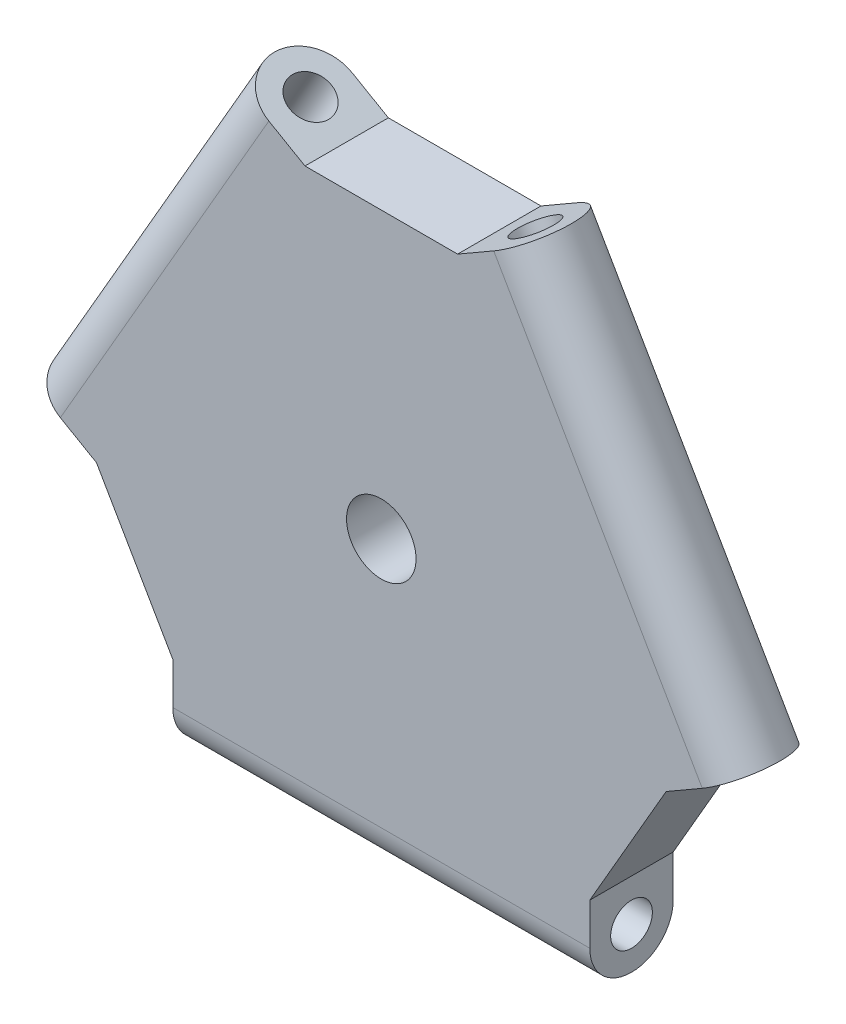
ISO-10303-21;
HEADER;
FILE_DESCRIPTION(('STEP AP214'),'2;1');
FILE_NAME('part.step','',(''),(''),'','','');
FILE_SCHEMA(('AUTOMOTIVE_DESIGN { 1 0 10303 214 1 1 1 1 }'));
ENDSEC;
DATA;
#1=APPLICATION_CONTEXT('core data for automotive mechanical design processes');
#2=APPLICATION_PROTOCOL_DEFINITION('international standard','automotive_design',2000,#1);
#3=PRODUCT_CONTEXT('',#1,'mechanical');
#4=PRODUCT('Part','Part','',(#3));
#5=PRODUCT_RELATED_PRODUCT_CATEGORY('part','',(#4));
#6=PRODUCT_DEFINITION_FORMATION('','',#4);
#7=PRODUCT_DEFINITION_CONTEXT('part definition',#1,'design');
#8=PRODUCT_DEFINITION('design','',#6,#7);
#9=PRODUCT_DEFINITION_SHAPE('','',#8);
#10=(LENGTH_UNIT() NAMED_UNIT(*) SI_UNIT(.MILLI.,.METRE.));
#11=(NAMED_UNIT(*) PLANE_ANGLE_UNIT() SI_UNIT($,.RADIAN.));
#12=(NAMED_UNIT(*) SI_UNIT($,.STERADIAN.) SOLID_ANGLE_UNIT());
#13=UNCERTAINTY_MEASURE_WITH_UNIT(LENGTH_MEASURE(1.E-05),#10,'distance_accuracy_value','');
#14=(GEOMETRIC_REPRESENTATION_CONTEXT(3) GLOBAL_UNCERTAINTY_ASSIGNED_CONTEXT((#13)) GLOBAL_UNIT_ASSIGNED_CONTEXT((#10,
#11,#12)) REPRESENTATION_CONTEXT('',''));
#15=CARTESIAN_POINT('',(0.,0.,0.));
#16=DIRECTION('',(0.,0.,1.));
#17=DIRECTION('',(1.,0.,0.));
#18=AXIS2_PLACEMENT_3D('',#15,#16,#17);
#19=CARTESIAN_POINT('',(0.,0.,12.));
#20=DIRECTION('',(0.,0.,1.));
#21=DIRECTION('',(1.,0.,0.));
#22=AXIS2_PLACEMENT_3D('',#19,#20,#21);
#23=PLANE('',#22);
#24=DIRECTION('',(0.499999999999996,0.866025403784441,0.));
#25=VECTOR('',#24,1.);
#26=CARTESIAN_POINT('',(40.9807621135334,-10.9807621135323,12.));
#27=LINE('',#26,#25);
#28=CARTESIAN_POINT('',(30.,-30.0000000000004,12.));
#29=VERTEX_POINT('',#28);
#30=CARTESIAN_POINT('',(40.9807621135334,-10.9807621135334,12.));
#31=VERTEX_POINT('',#30);
#32=EDGE_CURVE('E180',#29,#31,#27,.T.);
#33=ORIENTED_EDGE('',*,*,#32,.T.);
#34=DIRECTION('',(-0.866025403784443,-0.499999999999992,0.));
#35=VECTOR('',#34,1.);
#36=CARTESIAN_POINT('',(14.9999999999998,-25.9807621135333,12.));
#37=LINE('',#36,#35);
#38=CARTESIAN_POINT('',(46.17691453624,-7.98076211353341,12.));
#39=VERTEX_POINT('',#38);
#40=EDGE_CURVE('E147',#39,#31,#37,.T.);
#41=ORIENTED_EDGE('',*,*,#40,.F.);
#42=DIRECTION('',(0.499999999999992,-0.866025403784443,0.));
#43=VECTOR('',#42,1.);
#44=CARTESIAN_POINT('',(16.1769145362405,43.9807621135332,12.));
#45=LINE('',#44,#43);
#46=CARTESIAN_POINT('',(16.1769145362405,43.9807621135332,12.));
#47=VERTEX_POINT('',#46);
#48=EDGE_CURVE('E153',#47,#39,#45,.T.);
#49=ORIENTED_EDGE('',*,*,#48,.F.);
#50=DIRECTION('',(-0.866025403784443,-0.499999999999992,0.));
#51=VECTOR('',#50,1.);
#52=CARTESIAN_POINT('',(-14.9999999999998,25.9807621135333,12.));
#53=LINE('',#52,#51);
#54=CARTESIAN_POINT('',(10.9807621135339,40.9807621135332,12.));
#55=VERTEX_POINT('',#54);
#56=EDGE_CURVE('E139',#47,#55,#53,.T.);
#57=ORIENTED_EDGE('',*,*,#56,.T.);
#58=DIRECTION('',(-1.,0.,0.));
#59=VECTOR('',#58,1.);
#60=CARTESIAN_POINT('',(-10.9807621135342,40.9807621135329,12.));
#61=LINE('',#60,#59);
#62=CARTESIAN_POINT('',(-10.9807621135342,40.9807621135329,12.));
#63=VERTEX_POINT('',#62);
#64=EDGE_CURVE('E191',#55,#63,#61,.T.);
#65=ORIENTED_EDGE('',*,*,#64,.T.);
#66=DIRECTION('',(0.866025403784436,-0.500000000000004,0.));
#67=VECTOR('',#66,1.);
#68=CARTESIAN_POINT('',(15.0000000000001,25.9807621135331,12.));
#69=LINE('',#68,#67);
#70=CARTESIAN_POINT('',(-16.1769145362399,43.9807621135334,12.));
#71=VERTEX_POINT('',#70);
#72=EDGE_CURVE('E165',#71,#63,#69,.T.);
#73=ORIENTED_EDGE('',*,*,#72,.F.);
#74=DIRECTION('',(0.500000000000004,0.866025403784436,0.));
#75=VECTOR('',#74,1.);
#76=CARTESIAN_POINT('',(-46.1769145362401,-7.98076211353276,12.));
#77=LINE('',#76,#75);
#78=CARTESIAN_POINT('',(-46.1769145362401,-7.98076211353276,12.));
#79=VERTEX_POINT('',#78);
#80=EDGE_CURVE('E170',#79,#71,#77,.T.);
#81=ORIENTED_EDGE('',*,*,#80,.F.);
#82=DIRECTION('',(0.866025403784436,-0.500000000000004,0.));
#83=VECTOR('',#82,1.);
#84=CARTESIAN_POINT('',(-15.0000000000001,-25.9807621135331,12.));
#85=LINE('',#84,#83);
#86=CARTESIAN_POINT('',(-40.9807621135329,-10.9807621135336,12.));
#87=VERTEX_POINT('',#86);
#88=EDGE_CURVE('E168',#79,#87,#85,.T.);
#89=ORIENTED_EDGE('',*,*,#88,.T.);
#90=DIRECTION('',(0.500000000000012,-0.866025403784431,0.));
#91=VECTOR('',#90,1.);
#92=CARTESIAN_POINT('',(-29.9999999999991,-30.0000000000009,12.));
#93=LINE('',#92,#91);
#94=CARTESIAN_POINT('',(-29.9999999999991,-30.0000000000009,12.));
#95=VERTEX_POINT('',#94);
#96=EDGE_CURVE('E200',#87,#95,#93,.T.);
#97=ORIENTED_EDGE('',*,*,#96,.T.);
#98=DIRECTION('',(0.,1.,0.));
#99=VECTOR('',#98,1.);
#100=CARTESIAN_POINT('',(-30.,0.,12.));
#101=LINE('',#100,#99);
#102=CARTESIAN_POINT('',(-30.,-36.0000000000004,12.));
#103=VERTEX_POINT('',#102);
#104=EDGE_CURVE('E215',#103,#95,#101,.T.);
#105=ORIENTED_EDGE('',*,*,#104,.F.);
#106=DIRECTION('',(-1.,0.,0.));
#107=VECTOR('',#106,1.);
#108=CARTESIAN_POINT('',(30.,-36.0000000000004,12.));
#109=LINE('',#108,#107);
#110=CARTESIAN_POINT('',(30.,-36.0000000000004,12.));
#111=VERTEX_POINT('',#110);
#112=EDGE_CURVE('E46',#111,#103,#109,.T.);
#113=ORIENTED_EDGE('',*,*,#112,.F.);
#114=DIRECTION('',(0.,1.,0.));
#115=VECTOR('',#114,1.);
#116=CARTESIAN_POINT('',(30.,0.,12.));
#117=LINE('',#116,#115);
#118=EDGE_CURVE('E219',#111,#29,#117,.T.);
#119=ORIENTED_EDGE('',*,*,#118,.T.);
#120=EDGE_LOOP('',(#33,#41,#49,#57,#65,#73,#81,#89,#97,#105,#113,#119));
#121=FACE_BOUND('',#120,.T.);
#122=CARTESIAN_POINT('',(0.,0.,12.));
#123=DIRECTION('',(0.,0.,-1.));
#124=DIRECTION('',(-1.,0.,0.));
#125=AXIS2_PLACEMENT_3D('',#122,#123,#124);
#126=CIRCLE('',#125,5.);
#127=CARTESIAN_POINT('',(-5.,0.,12.));
#128=VERTEX_POINT('',#127);
#129=EDGE_CURVE('E205',#128,#128,#126,.T.);
#130=ORIENTED_EDGE('',*,*,#129,.T.);
#131=EDGE_LOOP('',(#130));
#132=FACE_BOUND('',#131,.T.);
#133=ADVANCED_FACE('F37',(#121,#132),#23,.T.);
#134=CARTESIAN_POINT('',(0.,0.,0.));
#135=DIRECTION('',(0.,0.,1.));
#136=DIRECTION('',(1.,0.,0.));
#137=AXIS2_PLACEMENT_3D('',#134,#135,#136);
#138=PLANE('',#137);
#139=CARTESIAN_POINT('',(0.,0.,0.));
#140=DIRECTION('',(0.,0.,-1.));
#141=DIRECTION('',(-1.,0.,0.));
#142=AXIS2_PLACEMENT_3D('',#139,#140,#141);
#143=CIRCLE('',#142,5.);
#144=CARTESIAN_POINT('',(-5.,0.,0.));
#145=VERTEX_POINT('',#144);
#146=EDGE_CURVE('E190',#145,#145,#143,.T.);
#147=ORIENTED_EDGE('',*,*,#146,.F.);
#148=EDGE_LOOP('',(#147));
#149=FACE_BOUND('',#148,.T.);
#150=DIRECTION('',(-1.,0.,0.));
#151=VECTOR('',#150,1.);
#152=CARTESIAN_POINT('',(-10.9807621135342,40.9807621135329,0.));
#153=LINE('',#152,#151);
#154=CARTESIAN_POINT('',(10.9807621135335,40.9807621135331,0.));
#155=VERTEX_POINT('',#154);
#156=CARTESIAN_POINT('',(-10.9807621135333,40.9807621135334,0.));
#157=VERTEX_POINT('',#156);
#158=EDGE_CURVE('E138',#155,#157,#153,.T.);
#159=ORIENTED_EDGE('',*,*,#158,.F.);
#160=DIRECTION('',(-0.866025403784443,-0.499999999999992,0.));
#161=VECTOR('',#160,1.);
#162=CARTESIAN_POINT('',(-14.9999999999998,25.9807621135333,0.));
#163=LINE('',#162,#161);
#164=CARTESIAN_POINT('',(16.1769145362405,43.9807621135332,0.));
#165=VERTEX_POINT('',#164);
#166=EDGE_CURVE('E53',#165,#155,#163,.T.);
#167=ORIENTED_EDGE('',*,*,#166,.F.);
#168=DIRECTION('',(0.499999999999992,-0.866025403784443,0.));
#169=VECTOR('',#168,1.);
#170=CARTESIAN_POINT('',(16.1769145362405,43.9807621135332,0.));
#171=LINE('',#170,#169);
#172=CARTESIAN_POINT('',(46.17691453624,-7.98076211353341,0.));
#173=VERTEX_POINT('',#172);
#174=EDGE_CURVE('E135',#165,#173,#171,.T.);
#175=ORIENTED_EDGE('',*,*,#174,.T.);
#176=DIRECTION('',(-0.866025403784443,-0.499999999999992,0.));
#177=VECTOR('',#176,1.);
#178=CARTESIAN_POINT('',(14.9999999999998,-25.9807621135333,0.));
#179=LINE('',#178,#177);
#180=CARTESIAN_POINT('',(40.9807621135334,-10.9807621135334,0.));
#181=VERTEX_POINT('',#180);
#182=EDGE_CURVE('E461',#173,#181,#179,.T.);
#183=ORIENTED_EDGE('',*,*,#182,.T.);
#184=DIRECTION('',(0.499999999999996,0.866025403784441,0.));
#185=VECTOR('',#184,1.);
#186=CARTESIAN_POINT('',(40.9807621135334,-10.9807621135323,0.));
#187=LINE('',#186,#185);
#188=CARTESIAN_POINT('',(30.,-29.9999999999998,0.));
#189=VERTEX_POINT('',#188);
#190=EDGE_CURVE('E184',#189,#181,#187,.T.);
#191=ORIENTED_EDGE('',*,*,#190,.F.);
#192=DIRECTION('',(0.,1.,0.));
#193=VECTOR('',#192,1.);
#194=CARTESIAN_POINT('',(30.,0.,0.));
#195=LINE('',#194,#193);
#196=CARTESIAN_POINT('',(30.,-36.0000000000004,0.));
#197=VERTEX_POINT('',#196);
#198=EDGE_CURVE('E82',#197,#189,#195,.T.);
#199=ORIENTED_EDGE('',*,*,#198,.F.);
#200=DIRECTION('',(-1.,0.,0.));
#201=VECTOR('',#200,1.);
#202=CARTESIAN_POINT('',(30.,-36.0000000000004,0.));
#203=LINE('',#202,#201);
#204=CARTESIAN_POINT('',(-30.,-36.0000000000004,0.));
#205=VERTEX_POINT('',#204);
#206=EDGE_CURVE('E11',#197,#205,#203,.T.);
#207=ORIENTED_EDGE('',*,*,#206,.T.);
#208=DIRECTION('',(0.,1.,0.));
#209=VECTOR('',#208,1.);
#210=CARTESIAN_POINT('',(-30.,0.,0.));
#211=LINE('',#210,#209);
#212=CARTESIAN_POINT('',(-30.,-30.0000000000004,0.));
#213=VERTEX_POINT('',#212);
#214=EDGE_CURVE('E223',#205,#213,#211,.T.);
#215=ORIENTED_EDGE('',*,*,#214,.T.);
#216=DIRECTION('',(0.500000000000012,-0.866025403784431,0.));
#217=VECTOR('',#216,1.);
#218=CARTESIAN_POINT('',(-29.9999999999991,-30.0000000000009,0.));
#219=LINE('',#218,#217);
#220=CARTESIAN_POINT('',(-40.9807621135329,-10.9807621135336,0.));
#221=VERTEX_POINT('',#220);
#222=EDGE_CURVE('E179',#221,#213,#219,.T.);
#223=ORIENTED_EDGE('',*,*,#222,.F.);
#224=DIRECTION('',(0.866025403784436,-0.500000000000004,0.));
#225=VECTOR('',#224,1.);
#226=CARTESIAN_POINT('',(-15.0000000000001,-25.9807621135331,0.));
#227=LINE('',#226,#225);
#228=CARTESIAN_POINT('',(-46.1769145362401,-7.98076211353276,0.));
#229=VERTEX_POINT('',#228);
#230=EDGE_CURVE('E164',#229,#221,#227,.T.);
#231=ORIENTED_EDGE('',*,*,#230,.F.);
#232=DIRECTION('',(0.500000000000004,0.866025403784436,0.));
#233=VECTOR('',#232,1.);
#234=CARTESIAN_POINT('',(-46.1769145362401,-7.98076211353276,0.));
#235=LINE('',#234,#233);
#236=CARTESIAN_POINT('',(-16.1769145362399,43.9807621135334,0.));
#237=VERTEX_POINT('',#236);
#238=EDGE_CURVE('E176',#229,#237,#235,.T.);
#239=ORIENTED_EDGE('',*,*,#238,.T.);
#240=DIRECTION('',(0.866025403784436,-0.500000000000004,0.));
#241=VECTOR('',#240,1.);
#242=CARTESIAN_POINT('',(15.0000000000001,25.9807621135331,0.));
#243=LINE('',#242,#241);
#244=EDGE_CURVE('E156',#237,#157,#243,.T.);
#245=ORIENTED_EDGE('',*,*,#244,.T.);
#246=EDGE_LOOP('',(#159,#167,#175,#183,#191,#199,#207,#215,#223,#231,#239,#245));
#247=FACE_BOUND('',#246,.T.);
#248=ADVANCED_FACE('F39',(#149,#247),#138,.F.);
#249=CARTESIAN_POINT('',(30.,-36.0000000000004,6.));
#250=DIRECTION('',(-1.,0.,0.));
#251=DIRECTION('',(0.,0.,1.));
#252=AXIS2_PLACEMENT_3D('',#249,#250,#251);
#253=CYLINDRICAL_SURFACE('',#252,6.);
#254=CARTESIAN_POINT('',(-30.,-36.0000000000004,6.));
#255=DIRECTION('',(1.,0.,0.));
#256=DIRECTION('',(0.,0.,-1.));
#257=AXIS2_PLACEMENT_3D('',#254,#255,#256);
#258=CIRCLE('',#257,6.);
#259=EDGE_CURVE('E221',#103,#205,#258,.T.);
#260=ORIENTED_EDGE('',*,*,#259,.T.);
#261=ORIENTED_EDGE('',*,*,#206,.F.);
#262=CARTESIAN_POINT('',(30.,-36.0000000000004,6.));
#263=DIRECTION('',(1.,0.,0.));
#264=DIRECTION('',(0.,0.,-1.));
#265=AXIS2_PLACEMENT_3D('',#262,#263,#264);
#266=CIRCLE('',#265,6.);
#267=EDGE_CURVE('E213',#111,#197,#266,.T.);
#268=ORIENTED_EDGE('',*,*,#267,.F.);
#269=ORIENTED_EDGE('',*,*,#112,.T.);
#270=EDGE_LOOP('',(#260,#261,#268,#269));
#271=FACE_BOUND('',#270,.T.);
#272=ADVANCED_FACE('F244',(#271),#253,.T.);
#273=CARTESIAN_POINT('',(30.,0.,0.));
#274=DIRECTION('',(1.,0.,0.));
#275=DIRECTION('',(0.,0.,-1.));
#276=AXIS2_PLACEMENT_3D('',#273,#274,#275);
#277=PLANE('',#276);
#278=CARTESIAN_POINT('',(30.,-36.0000000000004,6.));
#279=DIRECTION('',(1.,0.,0.));
#280=DIRECTION('',(0.,0.,-1.));
#281=AXIS2_PLACEMENT_3D('',#278,#279,#280);
#282=CIRCLE('',#281,3.);
#283=CARTESIAN_POINT('',(30.,-36.0000000000004,3.));
#284=VERTEX_POINT('',#283);
#285=EDGE_CURVE('E208',#284,#284,#282,.T.);
#286=ORIENTED_EDGE('',*,*,#285,.F.);
#287=EDGE_LOOP('',(#286));
#288=FACE_BOUND('',#287,.T.);
#289=ORIENTED_EDGE('',*,*,#267,.T.);
#290=ORIENTED_EDGE('',*,*,#198,.T.);
#291=DIRECTION('',(0.,0.,-1.));
#292=VECTOR('',#291,1.);
#293=CARTESIAN_POINT('',(30.,-30.0000000000004,0.));
#294=LINE('',#293,#292);
#295=EDGE_CURVE('E217',#29,#189,#294,.T.);
#296=ORIENTED_EDGE('',*,*,#295,.F.);
#297=ORIENTED_EDGE('',*,*,#118,.F.);
#298=EDGE_LOOP('',(#289,#290,#296,#297));
#299=FACE_BOUND('',#298,.T.);
#300=ADVANCED_FACE('F246',(#288,#299),#277,.T.);
#301=CARTESIAN_POINT('',(-30.,0.,0.));
#302=DIRECTION('',(1.,0.,0.));
#303=DIRECTION('',(0.,0.,-1.));
#304=AXIS2_PLACEMENT_3D('',#301,#302,#303);
#305=PLANE('',#304);
#306=CARTESIAN_POINT('',(-30.,-36.0000000000004,6.));
#307=DIRECTION('',(1.,0.,0.));
#308=DIRECTION('',(0.,0.,-1.));
#309=AXIS2_PLACEMENT_3D('',#306,#307,#308);
#310=CIRCLE('',#309,3.);
#311=CARTESIAN_POINT('',(-30.,-36.0000000000004,3.));
#312=VERTEX_POINT('',#311);
#313=EDGE_CURVE('E41',#312,#312,#310,.T.);
#314=ORIENTED_EDGE('',*,*,#313,.T.);
#315=EDGE_LOOP('',(#314));
#316=FACE_BOUND('',#315,.T.);
#317=ORIENTED_EDGE('',*,*,#259,.F.);
#318=ORIENTED_EDGE('',*,*,#104,.T.);
#319=DIRECTION('',(0.,0.,-1.));
#320=VECTOR('',#319,1.);
#321=CARTESIAN_POINT('',(-30.,-30.0000000000004,0.));
#322=LINE('',#321,#320);
#323=EDGE_CURVE('E226',#95,#213,#322,.T.);
#324=ORIENTED_EDGE('',*,*,#323,.T.);
#325=ORIENTED_EDGE('',*,*,#214,.F.);
#326=EDGE_LOOP('',(#317,#318,#324,#325));
#327=FACE_BOUND('',#326,.T.);
#328=ADVANCED_FACE('F232',(#316,#327),#305,.F.);
#329=CARTESIAN_POINT('',(-51.9615242270664,-36.0000000000004,6.));
#330=DIRECTION('',(1.,0.,0.));
#331=DIRECTION('',(0.,0.,-1.));
#332=AXIS2_PLACEMENT_3D('',#329,#330,#331);
#333=CYLINDRICAL_SURFACE('',#332,3.);
#334=ORIENTED_EDGE('',*,*,#285,.T.);
#335=EDGE_LOOP('',(#334));
#336=FACE_BOUND('',#335,.T.);
#337=ORIENTED_EDGE('',*,*,#313,.F.);
#338=EDGE_LOOP('',(#337));
#339=FACE_BOUND('',#338,.T.);
#340=ADVANCED_FACE('F389',(#336,#339),#333,.F.);
#341=CARTESIAN_POINT('',(0.,0.,12.));
#342=DIRECTION('',(0.,0.,-1.));
#343=DIRECTION('',(-1.,0.,0.));
#344=AXIS2_PLACEMENT_3D('',#341,#342,#343);
#345=CYLINDRICAL_SURFACE('',#344,5.);
#346=ORIENTED_EDGE('',*,*,#129,.F.);
#347=EDGE_LOOP('',(#346));
#348=FACE_BOUND('',#347,.T.);
#349=ORIENTED_EDGE('',*,*,#146,.T.);
#350=EDGE_LOOP('',(#349));
#351=FACE_BOUND('',#350,.T.);
#352=ADVANCED_FACE('F276',(#348,#351),#345,.F.);
#353=CARTESIAN_POINT('',(-29.9999999999991,-30.0000000000009,12.));
#354=DIRECTION('',(0.866025403784432,0.500000000000012,0.));
#355=DIRECTION('',(-0.500000000000012,0.866025403784432,0.));
#356=AXIS2_PLACEMENT_3D('',#353,#354,#355);
#357=PLANE('',#356);
#358=ORIENTED_EDGE('',*,*,#222,.T.);
#359=ORIENTED_EDGE('',*,*,#323,.F.);
#360=ORIENTED_EDGE('',*,*,#96,.F.);
#361=DIRECTION('',(0.,0.,-1.));
#362=VECTOR('',#361,1.);
#363=CARTESIAN_POINT('',(-40.9807621135329,-10.9807621135336,12.));
#364=LINE('',#363,#362);
#365=EDGE_CURVE('E196',#87,#221,#364,.T.);
#366=ORIENTED_EDGE('',*,*,#365,.T.);
#367=EDGE_LOOP('',(#358,#359,#360,#366));
#368=FACE_BOUND('',#367,.T.);
#369=ADVANCED_FACE('F237',(#368),#357,.F.);
#370=CARTESIAN_POINT('',(40.9807621135334,-10.9807621135323,12.));
#371=DIRECTION('',(-0.866025403784441,0.499999999999996,0.));
#372=DIRECTION('',(-0.499999999999996,-0.866025403784441,0.));
#373=AXIS2_PLACEMENT_3D('',#370,#371,#372);
#374=PLANE('',#373);
#375=ORIENTED_EDGE('',*,*,#190,.T.);
#376=DIRECTION('',(0.,0.,-1.));
#377=VECTOR('',#376,1.);
#378=CARTESIAN_POINT('',(40.9807621135334,-10.9807621135323,12.));
#379=LINE('',#378,#377);
#380=EDGE_CURVE('E183',#31,#181,#379,.T.);
#381=ORIENTED_EDGE('',*,*,#380,.F.);
#382=ORIENTED_EDGE('',*,*,#32,.F.);
#383=ORIENTED_EDGE('',*,*,#295,.T.);
#384=EDGE_LOOP('',(#375,#381,#382,#383));
#385=FACE_BOUND('',#384,.T.);
#386=ADVANCED_FACE('F275',(#385),#374,.F.);
#387=CARTESIAN_POINT('',(-10.9807621135342,40.9807621135329,12.));
#388=DIRECTION('',(0.,-1.,0.));
#389=DIRECTION('',(1.,0.,0.));
#390=AXIS2_PLACEMENT_3D('',#387,#388,#389);
#391=PLANE('',#390);
#392=ORIENTED_EDGE('',*,*,#158,.T.);
#393=DIRECTION('',(0.,0.,-1.));
#394=VECTOR('',#393,1.);
#395=CARTESIAN_POINT('',(-10.9807621135342,40.9807621135329,12.));
#396=LINE('',#395,#394);
#397=EDGE_CURVE('E187',#63,#157,#396,.T.);
#398=ORIENTED_EDGE('',*,*,#397,.F.);
#399=ORIENTED_EDGE('',*,*,#64,.F.);
#400=DIRECTION('',(0.,0.,-1.));
#401=VECTOR('',#400,1.);
#402=CARTESIAN_POINT('',(10.9807621135328,40.9807621135331,12.));
#403=LINE('',#402,#401);
#404=EDGE_CURVE('E194',#55,#155,#403,.T.);
#405=ORIENTED_EDGE('',*,*,#404,.T.);
#406=EDGE_LOOP('',(#392,#398,#399,#405));
#407=FACE_BOUND('',#406,.T.);
#408=ADVANCED_FACE('F287',(#407),#391,.F.);
#409=CARTESIAN_POINT('',(-46.1769145362401,-7.98076211353276,6.));
#410=DIRECTION('',(0.500000000000004,0.866025403784436,0.));
#411=DIRECTION('',(-0.866025403784436,0.500000000000004,0.));
#412=AXIS2_PLACEMENT_3D('',#409,#410,#411);
#413=CYLINDRICAL_SURFACE('',#412,6.);
#414=CARTESIAN_POINT('',(-16.1769145362399,43.9807621135334,6.));
#415=DIRECTION('',(-0.500000000000004,-0.866025403784436,0.));
#416=DIRECTION('',(0.,0.,-1.));
#417=AXIS2_PLACEMENT_3D('',#414,#415,#416);
#418=CIRCLE('',#417,6.);
#419=EDGE_CURVE('E152',#71,#237,#418,.T.);
#420=ORIENTED_EDGE('',*,*,#419,.T.);
#421=ORIENTED_EDGE('',*,*,#238,.F.);
#422=CARTESIAN_POINT('',(-46.1769145362401,-7.98076211353276,6.));
#423=DIRECTION('',(-0.500000000000004,-0.866025403784436,0.));
#424=DIRECTION('',(0.,0.,-1.));
#425=AXIS2_PLACEMENT_3D('',#422,#423,#424);
#426=CIRCLE('',#425,6.);
#427=EDGE_CURVE('E161',#79,#229,#426,.T.);
#428=ORIENTED_EDGE('',*,*,#427,.F.);
#429=ORIENTED_EDGE('',*,*,#80,.T.);
#430=EDGE_LOOP('',(#420,#421,#428,#429));
#431=FACE_BOUND('',#430,.T.);
#432=ADVANCED_FACE('F297',(#431),#413,.T.);
#433=CARTESIAN_POINT('',(-15.0000000000001,-25.9807621135331,0.));
#434=DIRECTION('',(-0.500000000000004,-0.866025403784436,0.));
#435=DIRECTION('',(0.,0.,-1.));
#436=AXIS2_PLACEMENT_3D('',#433,#434,#435);
#437=PLANE('',#436);
#438=CARTESIAN_POINT('',(-46.1769145362401,-7.98076211353276,6.));
#439=DIRECTION('',(-0.500000000000004,-0.866025403784436,0.));
#440=DIRECTION('',(0.866025403784436,-0.500000000000004,0.));
#441=AXIS2_PLACEMENT_3D('',#438,#439,#440);
#442=CIRCLE('',#441,3.);
#443=CARTESIAN_POINT('',(-43.5788383248868,-9.48076211353277,6.));
#444=VERTEX_POINT('',#443);
#445=EDGE_CURVE('E472',#444,#444,#442,.T.);
#446=ORIENTED_EDGE('',*,*,#445,.F.);
#447=EDGE_LOOP('',(#446));
#448=FACE_BOUND('',#447,.T.);
#449=ORIENTED_EDGE('',*,*,#427,.T.);
#450=ORIENTED_EDGE('',*,*,#230,.T.);
#451=ORIENTED_EDGE('',*,*,#365,.F.);
#452=ORIENTED_EDGE('',*,*,#88,.F.);
#453=EDGE_LOOP('',(#449,#450,#451,#452));
#454=FACE_BOUND('',#453,.T.);
#455=ADVANCED_FACE('F240',(#448,#454),#437,.T.);
#456=CARTESIAN_POINT('',(15.0000000000001,25.9807621135331,0.));
#457=DIRECTION('',(-0.500000000000004,-0.866025403784436,0.));
#458=DIRECTION('',(0.,0.,-1.));
#459=AXIS2_PLACEMENT_3D('',#456,#457,#458);
#460=PLANE('',#459);
#461=CARTESIAN_POINT('',(-16.1769145362399,43.9807621135334,6.));
#462=DIRECTION('',(0.500000000000004,0.866025403784436,0.));
#463=DIRECTION('',(-0.866025403784436,0.500000000000004,0.));
#464=AXIS2_PLACEMENT_3D('',#461,#462,#463);
#465=CIRCLE('',#464,3.);
#466=CARTESIAN_POINT('',(-18.7749907475932,45.4807621135335,6.));
#467=VERTEX_POINT('',#466);
#468=EDGE_CURVE('E474',#467,#467,#465,.T.);
#469=ORIENTED_EDGE('',*,*,#468,.F.);
#470=EDGE_LOOP('',(#469));
#471=FACE_BOUND('',#470,.T.);
#472=ORIENTED_EDGE('',*,*,#419,.F.);
#473=ORIENTED_EDGE('',*,*,#72,.T.);
#474=ORIENTED_EDGE('',*,*,#397,.T.);
#475=ORIENTED_EDGE('',*,*,#244,.F.);
#476=EDGE_LOOP('',(#472,#473,#474,#475));
#477=FACE_BOUND('',#476,.T.);
#478=ADVANCED_FACE('F318',(#471,#477),#460,.F.);
#479=CARTESIAN_POINT('',(16.1769145362405,43.9807621135332,6.));
#480=DIRECTION('',(0.499999999999992,-0.866025403784443,0.));
#481=DIRECTION('',(0.866025403784443,0.499999999999992,0.));
#482=AXIS2_PLACEMENT_3D('',#479,#480,#481);
#483=CYLINDRICAL_SURFACE('',#482,6.);
#484=CARTESIAN_POINT('',(46.17691453624,-7.98076211353341,6.));
#485=DIRECTION('',(-0.499999999999992,0.866025403784443,0.));
#486=DIRECTION('',(0.,0.,-1.));
#487=AXIS2_PLACEMENT_3D('',#484,#485,#486);
#488=CIRCLE('',#487,6.);
#489=EDGE_CURVE('E151',#39,#173,#488,.T.);
#490=ORIENTED_EDGE('',*,*,#489,.T.);
#491=ORIENTED_EDGE('',*,*,#174,.F.);
#492=CARTESIAN_POINT('',(16.1769145362405,43.9807621135332,6.));
#493=DIRECTION('',(-0.499999999999992,0.866025403784443,0.));
#494=DIRECTION('',(0.,0.,-1.));
#495=AXIS2_PLACEMENT_3D('',#492,#493,#494);
#496=CIRCLE('',#495,6.);
#497=EDGE_CURVE('E140',#47,#165,#496,.T.);
#498=ORIENTED_EDGE('',*,*,#497,.F.);
#499=ORIENTED_EDGE('',*,*,#48,.T.);
#500=EDGE_LOOP('',(#490,#491,#498,#499));
#501=FACE_BOUND('',#500,.T.);
#502=ADVANCED_FACE('F149',(#501),#483,.T.);
#503=CARTESIAN_POINT('',(-14.9999999999998,25.9807621135333,0.));
#504=DIRECTION('',(-0.499999999999992,0.866025403784443,0.));
#505=DIRECTION('',(0.,0.,-1.));
#506=AXIS2_PLACEMENT_3D('',#503,#504,#505);
#507=PLANE('',#506);
#508=CARTESIAN_POINT('',(16.1769145362405,43.9807621135332,6.));
#509=DIRECTION('',(-0.499999999999992,0.866025403784443,0.));
#510=DIRECTION('',(-0.866025403784443,-0.499999999999992,0.));
#511=AXIS2_PLACEMENT_3D('',#508,#509,#510);
#512=CIRCLE('',#511,3.00000000000001);
#513=CARTESIAN_POINT('',(13.5788383248872,42.4807621135332,6.));
#514=VERTEX_POINT('',#513);
#515=EDGE_CURVE('E465',#514,#514,#512,.T.);
#516=ORIENTED_EDGE('',*,*,#515,.F.);
#517=EDGE_LOOP('',(#516));
#518=FACE_BOUND('',#517,.T.);
#519=ORIENTED_EDGE('',*,*,#497,.T.);
#520=ORIENTED_EDGE('',*,*,#166,.T.);
#521=ORIENTED_EDGE('',*,*,#404,.F.);
#522=ORIENTED_EDGE('',*,*,#56,.F.);
#523=EDGE_LOOP('',(#519,#520,#521,#522));
#524=FACE_BOUND('',#523,.T.);
#525=ADVANCED_FACE('F144',(#518,#524),#507,.T.);
#526=CARTESIAN_POINT('',(14.9999999999998,-25.9807621135333,0.));
#527=DIRECTION('',(-0.499999999999992,0.866025403784443,0.));
#528=DIRECTION('',(0.,0.,-1.));
#529=AXIS2_PLACEMENT_3D('',#526,#527,#528);
#530=PLANE('',#529);
#531=CARTESIAN_POINT('',(46.17691453624,-7.98076211353341,6.));
#532=DIRECTION('',(0.499999999999992,-0.866025403784443,0.));
#533=DIRECTION('',(0.866025403784443,0.499999999999992,0.));
#534=AXIS2_PLACEMENT_3D('',#531,#532,#533);
#535=CIRCLE('',#534,3.00000000000001);
#536=CARTESIAN_POINT('',(48.7749907475934,-6.48076211353344,6.));
#537=VERTEX_POINT('',#536);
#538=EDGE_CURVE('E469',#537,#537,#535,.T.);
#539=ORIENTED_EDGE('',*,*,#538,.F.);
#540=EDGE_LOOP('',(#539));
#541=FACE_BOUND('',#540,.T.);
#542=ORIENTED_EDGE('',*,*,#489,.F.);
#543=ORIENTED_EDGE('',*,*,#40,.T.);
#544=ORIENTED_EDGE('',*,*,#380,.T.);
#545=ORIENTED_EDGE('',*,*,#182,.F.);
#546=EDGE_LOOP('',(#542,#543,#544,#545));
#547=FACE_BOUND('',#546,.T.);
#548=ADVANCED_FACE('F330',(#541,#547),#530,.F.);
#549=CARTESIAN_POINT('',(-2.00961894323252,75.4807621135335,6.));
#550=DIRECTION('',(0.499999999999992,-0.866025403784443,0.));
#551=DIRECTION('',(0.866025403784443,0.499999999999992,0.));
#552=AXIS2_PLACEMENT_3D('',#549,#550,#551);
#553=CYLINDRICAL_SURFACE('',#552,3.00000000000001);
#554=ORIENTED_EDGE('',*,*,#515,.T.);
#555=EDGE_LOOP('',(#554));
#556=FACE_BOUND('',#555,.T.);
#557=ORIENTED_EDGE('',*,*,#538,.T.);
#558=EDGE_LOOP('',(#557));
#559=FACE_BOUND('',#558,.T.);
#560=ADVANCED_FACE('F342',(#556,#559),#553,.F.);
#561=CARTESIAN_POINT('',(-62.2067147554504,-35.7451905283833,6.));
#562=DIRECTION('',(0.500000000000004,0.866025403784436,0.));
#563=DIRECTION('',(-0.866025403784436,0.500000000000004,0.));
#564=AXIS2_PLACEMENT_3D('',#561,#562,#563);
#565=CYLINDRICAL_SURFACE('',#564,3.);
#566=ORIENTED_EDGE('',*,*,#445,.T.);
#567=EDGE_LOOP('',(#566));
#568=FACE_BOUND('',#567,.T.);
#569=ORIENTED_EDGE('',*,*,#468,.T.);
#570=EDGE_LOOP('',(#569));
#571=FACE_BOUND('',#570,.T.);
#572=ADVANCED_FACE('F353',(#568,#571),#565,.F.);
#573=CLOSED_SHELL('',(#133,#248,#272,#300,#328,#340,#352,#369,#386,#408,#432,#455,#478,#502,
#525,#548,#560,#572));
#574=MANIFOLD_SOLID_BREP('B2',#573);
#575=ADVANCED_BREP_SHAPE_REPRESENTATION('',(#18,#574),#14);
#576=SHAPE_DEFINITION_REPRESENTATION(#9,#575);
ENDSEC;
END-ISO-10303-21;
